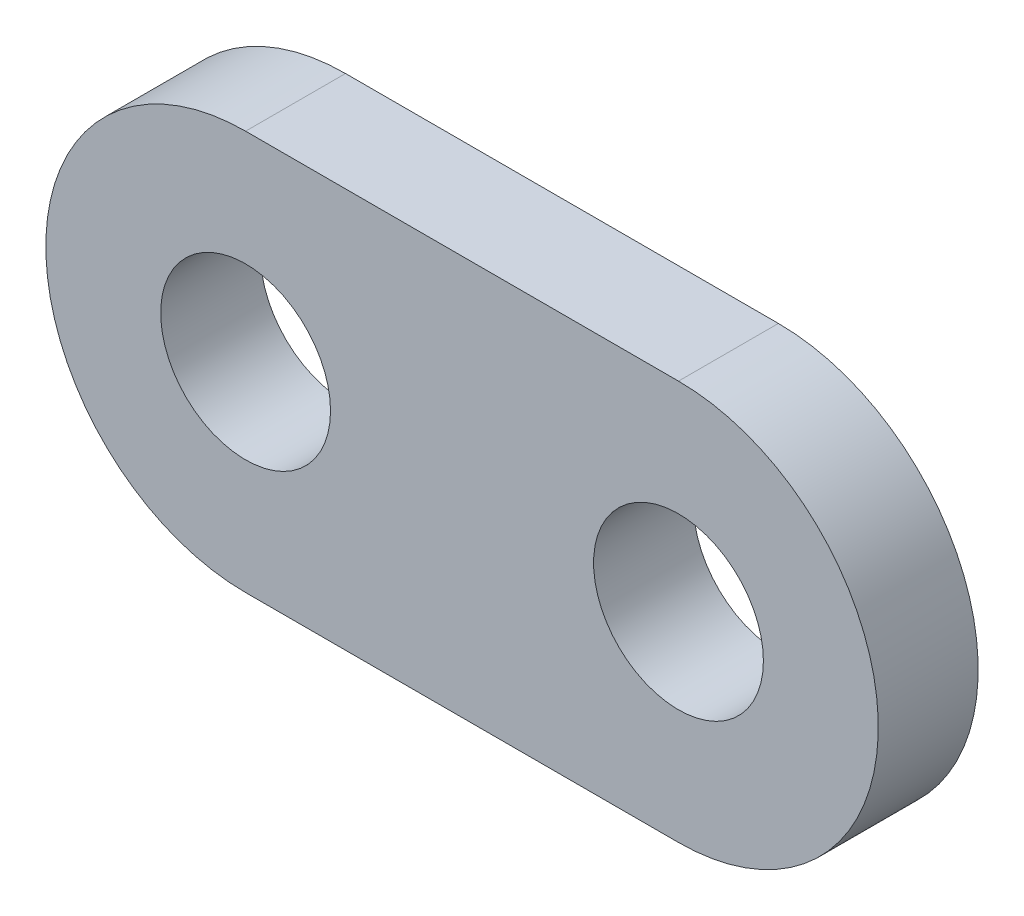
ISO-10303-21;
HEADER;
FILE_DESCRIPTION(('STEP AP214'),'2;1');
FILE_NAME('part.step','',(''),(''),'','','');
FILE_SCHEMA(('AUTOMOTIVE_DESIGN { 1 0 10303 214 1 1 1 1 }'));
ENDSEC;
DATA;
#1=APPLICATION_CONTEXT('core data for automotive mechanical design processes');
#2=APPLICATION_PROTOCOL_DEFINITION('international standard','automotive_design',2000,#1);
#3=PRODUCT_CONTEXT('',#1,'mechanical');
#4=PRODUCT('Part','Part','',(#3));
#5=PRODUCT_RELATED_PRODUCT_CATEGORY('part','',(#4));
#6=PRODUCT_DEFINITION_FORMATION('','',#4);
#7=PRODUCT_DEFINITION_CONTEXT('part definition',#1,'design');
#8=PRODUCT_DEFINITION('design','',#6,#7);
#9=PRODUCT_DEFINITION_SHAPE('','',#8);
#10=(LENGTH_UNIT() NAMED_UNIT(*) SI_UNIT(.MILLI.,.METRE.));
#11=(NAMED_UNIT(*) PLANE_ANGLE_UNIT() SI_UNIT($,.RADIAN.));
#12=(NAMED_UNIT(*) SI_UNIT($,.STERADIAN.) SOLID_ANGLE_UNIT());
#13=UNCERTAINTY_MEASURE_WITH_UNIT(LENGTH_MEASURE(1.E-05),#10,'distance_accuracy_value','');
#14=(GEOMETRIC_REPRESENTATION_CONTEXT(3) GLOBAL_UNCERTAINTY_ASSIGNED_CONTEXT((#13)) GLOBAL_UNIT_ASSIGNED_CONTEXT((#10,
#11,#12)) REPRESENTATION_CONTEXT('',''));
#15=CARTESIAN_POINT('',(0.,0.,0.));
#16=DIRECTION('',(0.,0.,1.));
#17=DIRECTION('',(1.,0.,0.));
#18=AXIS2_PLACEMENT_3D('',#15,#16,#17);
#19=CARTESIAN_POINT('',(6.,6.,3.));
#20=DIRECTION('',(0.,0.,1.));
#21=DIRECTION('',(1.,0.,0.));
#22=AXIS2_PLACEMENT_3D('',#19,#20,#21);
#23=PLANE('',#22);
#24=CARTESIAN_POINT('',(6.,6.,3.));
#25=DIRECTION('',(0.,0.,1.));
#26=DIRECTION('',(1.,0.,0.));
#27=AXIS2_PLACEMENT_3D('',#24,#25,#26);
#28=CIRCLE('',#27,2.55);
#29=CARTESIAN_POINT('',(8.55,6.,3.));
#30=VERTEX_POINT('',#29);
#31=EDGE_CURVE('E100',#30,#30,#28,.T.);
#32=ORIENTED_EDGE('',*,*,#31,.F.);
#33=EDGE_LOOP('',(#32));
#34=FACE_BOUND('',#33,.T.);
#35=CARTESIAN_POINT('',(6.,6.,3.));
#36=DIRECTION('',(0.,0.,1.));
#37=DIRECTION('',(1.,0.,0.));
#38=AXIS2_PLACEMENT_3D('',#35,#36,#37);
#39=CIRCLE('',#38,6.);
#40=CARTESIAN_POINT('',(6.,12.,3.));
#41=VERTEX_POINT('',#40);
#42=CARTESIAN_POINT('',(6.,0.,3.));
#43=VERTEX_POINT('',#42);
#44=EDGE_CURVE('E85',#41,#43,#39,.T.);
#45=ORIENTED_EDGE('',*,*,#44,.T.);
#46=DIRECTION('',(1.,0.,0.));
#47=VECTOR('',#46,1.);
#48=CARTESIAN_POINT('',(6.,0.,3.));
#49=LINE('',#48,#47);
#50=CARTESIAN_POINT('',(19.,0.,3.));
#51=VERTEX_POINT('',#50);
#52=EDGE_CURVE('E80',#43,#51,#49,.T.);
#53=ORIENTED_EDGE('',*,*,#52,.T.);
#54=CARTESIAN_POINT('',(19.,6.,3.));
#55=DIRECTION('',(0.,0.,1.));
#56=DIRECTION('',(1.,0.,0.));
#57=AXIS2_PLACEMENT_3D('',#54,#55,#56);
#58=CIRCLE('',#57,6.);
#59=CARTESIAN_POINT('',(19.,12.,3.));
#60=VERTEX_POINT('',#59);
#61=EDGE_CURVE('E83',#51,#60,#58,.T.);
#62=ORIENTED_EDGE('',*,*,#61,.T.);
#63=DIRECTION('',(-1.,0.,0.));
#64=VECTOR('',#63,1.);
#65=CARTESIAN_POINT('',(19.,12.,3.));
#66=LINE('',#65,#64);
#67=EDGE_CURVE('E50',#60,#41,#66,.T.);
#68=ORIENTED_EDGE('',*,*,#67,.T.);
#69=EDGE_LOOP('',(#45,#53,#62,#68));
#70=FACE_BOUND('',#69,.T.);
#71=CARTESIAN_POINT('',(19.,6.,3.));
#72=DIRECTION('',(0.,0.,1.));
#73=DIRECTION('',(1.,0.,0.));
#74=AXIS2_PLACEMENT_3D('',#71,#72,#73);
#75=CIRCLE('',#74,2.55);
#76=CARTESIAN_POINT('',(21.55,6.,3.));
#77=VERTEX_POINT('',#76);
#78=EDGE_CURVE('E115',#77,#77,#75,.T.);
#79=ORIENTED_EDGE('',*,*,#78,.F.);
#80=EDGE_LOOP('',(#79));
#81=FACE_BOUND('',#80,.T.);
#82=ADVANCED_FACE('F33',(#34,#70,#81),#23,.T.);
#83=CARTESIAN_POINT('',(6.,6.,0.));
#84=DIRECTION('',(0.,0.,1.));
#85=DIRECTION('',(1.,0.,0.));
#86=AXIS2_PLACEMENT_3D('',#83,#84,#85);
#87=PLANE('',#86);
#88=CARTESIAN_POINT('',(6.,6.,0.));
#89=DIRECTION('',(0.,0.,1.));
#90=DIRECTION('',(1.,0.,0.));
#91=AXIS2_PLACEMENT_3D('',#88,#89,#90);
#92=CIRCLE('',#91,2.55);
#93=CARTESIAN_POINT('',(8.55,6.,0.));
#94=VERTEX_POINT('',#93);
#95=EDGE_CURVE('E112',#94,#94,#92,.T.);
#96=ORIENTED_EDGE('',*,*,#95,.T.);
#97=EDGE_LOOP('',(#96));
#98=FACE_BOUND('',#97,.T.);
#99=CARTESIAN_POINT('',(6.,6.,0.));
#100=DIRECTION('',(0.,0.,1.));
#101=DIRECTION('',(1.,0.,0.));
#102=AXIS2_PLACEMENT_3D('',#99,#100,#101);
#103=CIRCLE('',#102,6.);
#104=CARTESIAN_POINT('',(6.,12.,0.));
#105=VERTEX_POINT('',#104);
#106=CARTESIAN_POINT('',(6.,0.,0.));
#107=VERTEX_POINT('',#106);
#108=EDGE_CURVE('E97',#105,#107,#103,.T.);
#109=ORIENTED_EDGE('',*,*,#108,.F.);
#110=DIRECTION('',(-1.,0.,0.));
#111=VECTOR('',#110,1.);
#112=CARTESIAN_POINT('',(19.,12.,0.));
#113=LINE('',#112,#111);
#114=CARTESIAN_POINT('',(19.,12.,0.));
#115=VERTEX_POINT('',#114);
#116=EDGE_CURVE('E73',#115,#105,#113,.T.);
#117=ORIENTED_EDGE('',*,*,#116,.F.);
#118=CARTESIAN_POINT('',(19.,6.,0.));
#119=DIRECTION('',(0.,0.,1.));
#120=DIRECTION('',(1.,0.,0.));
#121=AXIS2_PLACEMENT_3D('',#118,#119,#120);
#122=CIRCLE('',#121,6.);
#123=CARTESIAN_POINT('',(19.,0.,0.));
#124=VERTEX_POINT('',#123);
#125=EDGE_CURVE('E67',#124,#115,#122,.T.);
#126=ORIENTED_EDGE('',*,*,#125,.F.);
#127=DIRECTION('',(1.,0.,0.));
#128=VECTOR('',#127,1.);
#129=CARTESIAN_POINT('',(6.,0.,0.));
#130=LINE('',#129,#128);
#131=EDGE_CURVE('E89',#107,#124,#130,.T.);
#132=ORIENTED_EDGE('',*,*,#131,.F.);
#133=EDGE_LOOP('',(#109,#117,#126,#132));
#134=FACE_BOUND('',#133,.T.);
#135=CARTESIAN_POINT('',(19.,6.,0.));
#136=DIRECTION('',(0.,0.,1.));
#137=DIRECTION('',(1.,0.,0.));
#138=AXIS2_PLACEMENT_3D('',#135,#136,#137);
#139=CIRCLE('',#138,2.55);
#140=CARTESIAN_POINT('',(21.55,6.,0.));
#141=VERTEX_POINT('',#140);
#142=EDGE_CURVE('E118',#141,#141,#139,.T.);
#143=ORIENTED_EDGE('',*,*,#142,.T.);
#144=EDGE_LOOP('',(#143));
#145=FACE_BOUND('',#144,.T.);
#146=ADVANCED_FACE('F108',(#98,#134,#145),#87,.F.);
#147=CARTESIAN_POINT('',(6.,6.,3.));
#148=DIRECTION('',(0.,0.,-1.));
#149=DIRECTION('',(-1.,0.,0.));
#150=AXIS2_PLACEMENT_3D('',#147,#148,#149);
#151=CYLINDRICAL_SURFACE('',#150,6.);
#152=ORIENTED_EDGE('',*,*,#108,.T.);
#153=DIRECTION('',(0.,0.,-1.));
#154=VECTOR('',#153,1.);
#155=CARTESIAN_POINT('',(6.,0.,3.));
#156=LINE('',#155,#154);
#157=EDGE_CURVE('E11',#43,#107,#156,.T.);
#158=ORIENTED_EDGE('',*,*,#157,.F.);
#159=ORIENTED_EDGE('',*,*,#44,.F.);
#160=DIRECTION('',(0.,0.,-1.));
#161=VECTOR('',#160,1.);
#162=CARTESIAN_POINT('',(6.,12.,3.));
#163=LINE('',#162,#161);
#164=EDGE_CURVE('E93',#41,#105,#163,.T.);
#165=ORIENTED_EDGE('',*,*,#164,.T.);
#166=EDGE_LOOP('',(#152,#158,#159,#165));
#167=FACE_BOUND('',#166,.T.);
#168=ADVANCED_FACE('F35',(#167),#151,.T.);
#169=CARTESIAN_POINT('',(6.,0.,3.));
#170=DIRECTION('',(0.,1.,0.));
#171=DIRECTION('',(0.,0.,1.));
#172=AXIS2_PLACEMENT_3D('',#169,#170,#171);
#173=PLANE('',#172);
#174=ORIENTED_EDGE('',*,*,#131,.T.);
#175=DIRECTION('',(0.,0.,-1.));
#176=VECTOR('',#175,1.);
#177=CARTESIAN_POINT('',(19.,0.,3.));
#178=LINE('',#177,#176);
#179=EDGE_CURVE('E42',#51,#124,#178,.T.);
#180=ORIENTED_EDGE('',*,*,#179,.F.);
#181=ORIENTED_EDGE('',*,*,#52,.F.);
#182=ORIENTED_EDGE('',*,*,#157,.T.);
#183=EDGE_LOOP('',(#174,#180,#181,#182));
#184=FACE_BOUND('',#183,.T.);
#185=ADVANCED_FACE('F88',(#184),#173,.F.);
#186=CARTESIAN_POINT('',(19.,6.,3.));
#187=DIRECTION('',(0.,0.,-1.));
#188=DIRECTION('',(-1.,0.,0.));
#189=AXIS2_PLACEMENT_3D('',#186,#187,#188);
#190=CYLINDRICAL_SURFACE('',#189,6.);
#191=ORIENTED_EDGE('',*,*,#125,.T.);
#192=DIRECTION('',(0.,0.,-1.));
#193=VECTOR('',#192,1.);
#194=CARTESIAN_POINT('',(19.,12.,3.));
#195=LINE('',#194,#193);
#196=EDGE_CURVE('E90',#60,#115,#195,.T.);
#197=ORIENTED_EDGE('',*,*,#196,.F.);
#198=ORIENTED_EDGE('',*,*,#61,.F.);
#199=ORIENTED_EDGE('',*,*,#179,.T.);
#200=EDGE_LOOP('',(#191,#197,#198,#199));
#201=FACE_BOUND('',#200,.T.);
#202=ADVANCED_FACE('F91',(#201),#190,.T.);
#203=CARTESIAN_POINT('',(19.,12.,3.));
#204=DIRECTION('',(0.,-1.,0.));
#205=DIRECTION('',(0.,0.,-1.));
#206=AXIS2_PLACEMENT_3D('',#203,#204,#205);
#207=PLANE('',#206);
#208=ORIENTED_EDGE('',*,*,#116,.T.);
#209=ORIENTED_EDGE('',*,*,#164,.F.);
#210=ORIENTED_EDGE('',*,*,#67,.F.);
#211=ORIENTED_EDGE('',*,*,#196,.T.);
#212=EDGE_LOOP('',(#208,#209,#210,#211));
#213=FACE_BOUND('',#212,.T.);
#214=ADVANCED_FACE('F105',(#213),#207,.F.);
#215=CARTESIAN_POINT('',(6.,6.,3.));
#216=DIRECTION('',(0.,0.,-1.));
#217=DIRECTION('',(-1.,0.,0.));
#218=AXIS2_PLACEMENT_3D('',#215,#216,#217);
#219=CYLINDRICAL_SURFACE('',#218,2.55);
#220=ORIENTED_EDGE('',*,*,#31,.T.);
#221=EDGE_LOOP('',(#220));
#222=FACE_BOUND('',#221,.T.);
#223=ORIENTED_EDGE('',*,*,#95,.F.);
#224=EDGE_LOOP('',(#223));
#225=FACE_BOUND('',#224,.T.);
#226=ADVANCED_FACE('F136',(#222,#225),#219,.F.);
#227=CARTESIAN_POINT('',(19.,6.,3.));
#228=DIRECTION('',(0.,0.,-1.));
#229=DIRECTION('',(-1.,0.,0.));
#230=AXIS2_PLACEMENT_3D('',#227,#228,#229);
#231=CYLINDRICAL_SURFACE('',#230,2.55);
#232=ORIENTED_EDGE('',*,*,#78,.T.);
#233=EDGE_LOOP('',(#232));
#234=FACE_BOUND('',#233,.T.);
#235=ORIENTED_EDGE('',*,*,#142,.F.);
#236=EDGE_LOOP('',(#235));
#237=FACE_BOUND('',#236,.T.);
#238=ADVANCED_FACE('F124',(#234,#237),#231,.F.);
#239=CLOSED_SHELL('',(#82,#146,#168,#185,#202,#214,#226,#238));
#240=MANIFOLD_SOLID_BREP('B2',#239);
#241=ADVANCED_BREP_SHAPE_REPRESENTATION('',(#18,#240),#14);
#242=SHAPE_DEFINITION_REPRESENTATION(#9,#241);
ENDSEC;
END-ISO-10303-21;
